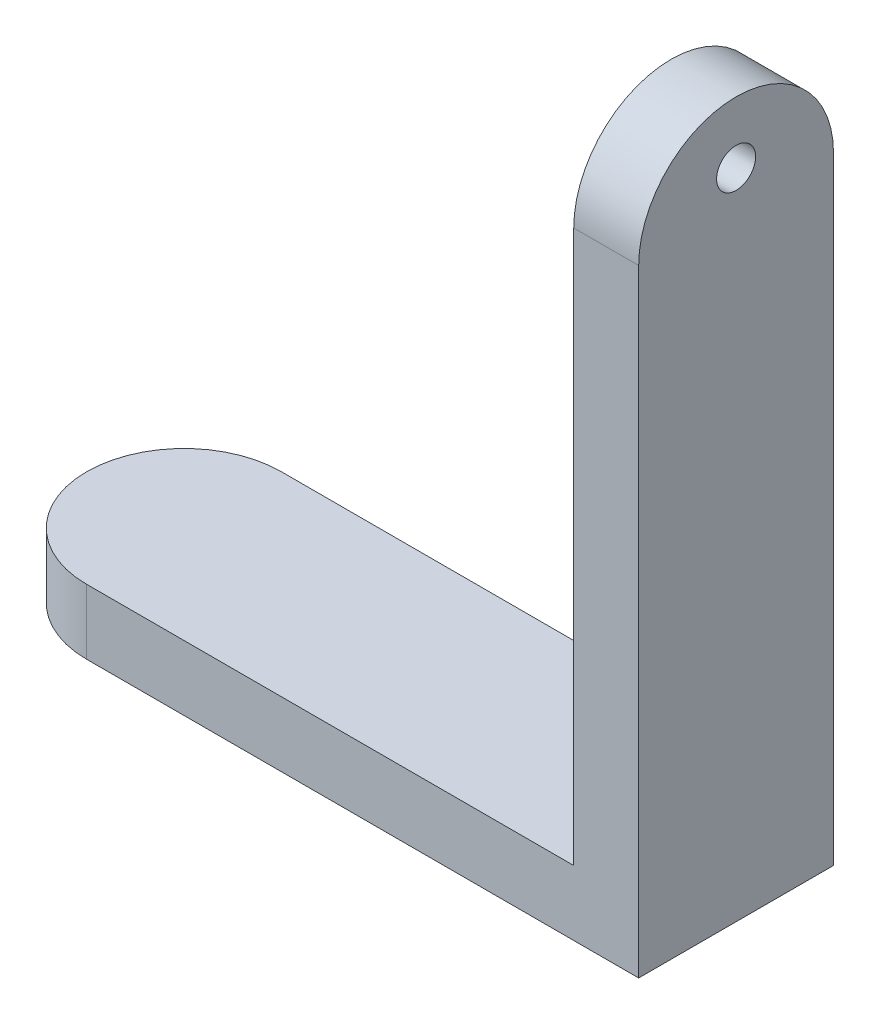
ISO-10303-21;
HEADER;
FILE_DESCRIPTION(('STEP AP214'),'2;1');
FILE_NAME('part.step','',(''),(''),'','','');
FILE_SCHEMA(('AUTOMOTIVE_DESIGN { 1 0 10303 214 1 1 1 1 }'));
ENDSEC;
DATA;
#1=APPLICATION_CONTEXT('core data for automotive mechanical design processes');
#2=APPLICATION_PROTOCOL_DEFINITION('international standard','automotive_design',2000,#1);
#3=PRODUCT_CONTEXT('',#1,'mechanical');
#4=PRODUCT('Part','Part','',(#3));
#5=PRODUCT_RELATED_PRODUCT_CATEGORY('part','',(#4));
#6=PRODUCT_DEFINITION_FORMATION('','',#4);
#7=PRODUCT_DEFINITION_CONTEXT('part definition',#1,'design');
#8=PRODUCT_DEFINITION('design','',#6,#7);
#9=PRODUCT_DEFINITION_SHAPE('','',#8);
#10=(LENGTH_UNIT() NAMED_UNIT(*) SI_UNIT(.MILLI.,.METRE.));
#11=(NAMED_UNIT(*) PLANE_ANGLE_UNIT() SI_UNIT($,.RADIAN.));
#12=(NAMED_UNIT(*) SI_UNIT($,.STERADIAN.) SOLID_ANGLE_UNIT());
#13=UNCERTAINTY_MEASURE_WITH_UNIT(LENGTH_MEASURE(1.E-05),#10,'distance_accuracy_value','');
#14=(GEOMETRIC_REPRESENTATION_CONTEXT(3) GLOBAL_UNCERTAINTY_ASSIGNED_CONTEXT((#13)) GLOBAL_UNIT_ASSIGNED_CONTEXT((#10,
#11,#12)) REPRESENTATION_CONTEXT('',''));
#15=CARTESIAN_POINT('',(0.,0.,0.));
#16=DIRECTION('',(0.,0.,1.));
#17=DIRECTION('',(1.,0.,0.));
#18=AXIS2_PLACEMENT_3D('',#15,#16,#17);
#19=CARTESIAN_POINT('',(10.16,24.13,0.));
#20=DIRECTION('',(-1.,0.,0.));
#21=DIRECTION('',(0.,0.,1.));
#22=AXIS2_PLACEMENT_3D('',#19,#20,#21);
#23=CYLINDRICAL_SURFACE('',#22,3.81);
#24=DIRECTION('',(1.,0.,0.));
#25=VECTOR('',#24,1.);
#26=CARTESIAN_POINT('',(10.16,24.13,-3.81));
#27=LINE('',#26,#25);
#28=CARTESIAN_POINT('',(10.16,24.13,-3.81));
#29=VERTEX_POINT('',#28);
#30=CARTESIAN_POINT('',(12.7,24.13,-3.81));
#31=VERTEX_POINT('',#30);
#32=EDGE_CURVE('E140',#29,#31,#27,.T.);
#33=ORIENTED_EDGE('',*,*,#32,.F.);
#34=CARTESIAN_POINT('',(10.16,24.13,0.));
#35=DIRECTION('',(1.,0.,0.));
#36=DIRECTION('',(0.,0.,-1.));
#37=AXIS2_PLACEMENT_3D('',#34,#35,#36);
#38=CIRCLE('',#37,3.81);
#39=CARTESIAN_POINT('',(10.16,24.13,3.81));
#40=VERTEX_POINT('',#39);
#41=EDGE_CURVE('E45',#40,#29,#38,.F.);
#42=ORIENTED_EDGE('',*,*,#41,.F.);
#43=DIRECTION('',(1.,0.,0.));
#44=VECTOR('',#43,1.);
#45=CARTESIAN_POINT('',(10.16,24.13,3.81));
#46=LINE('',#45,#44);
#47=CARTESIAN_POINT('',(12.7,24.13,3.81));
#48=VERTEX_POINT('',#47);
#49=EDGE_CURVE('E93',#48,#40,#46,.F.);
#50=ORIENTED_EDGE('',*,*,#49,.F.);
#51=CARTESIAN_POINT('',(12.7,24.13,0.));
#52=DIRECTION('',(-1.,0.,0.));
#53=DIRECTION('',(0.,0.,1.));
#54=AXIS2_PLACEMENT_3D('',#51,#52,#53);
#55=CIRCLE('',#54,3.81);
#56=EDGE_CURVE('E11',#31,#48,#55,.F.);
#57=ORIENTED_EDGE('',*,*,#56,.F.);
#58=EDGE_LOOP('',(#33,#42,#50,#57));
#59=FACE_BOUND('',#58,.T.);
#60=ADVANCED_FACE('F37',(#59),#23,.T.);
#61=CARTESIAN_POINT('',(-8.89,2.54,0.));
#62=DIRECTION('',(0.,-1.,0.));
#63=DIRECTION('',(0.,0.,-1.));
#64=AXIS2_PLACEMENT_3D('',#61,#62,#63);
#65=CYLINDRICAL_SURFACE('',#64,3.81);
#66=DIRECTION('',(0.,-1.,0.));
#67=VECTOR('',#66,1.);
#68=CARTESIAN_POINT('',(-8.89,2.54,3.81));
#69=LINE('',#68,#67);
#70=CARTESIAN_POINT('',(-8.89,2.54,3.81));
#71=VERTEX_POINT('',#70);
#72=CARTESIAN_POINT('',(-8.89,0.,3.81));
#73=VERTEX_POINT('',#72);
#74=EDGE_CURVE('E132',#71,#73,#69,.T.);
#75=ORIENTED_EDGE('',*,*,#74,.F.);
#76=CARTESIAN_POINT('',(-8.89,2.54,0.));
#77=DIRECTION('',(0.,1.,0.));
#78=DIRECTION('',(0.,0.,1.));
#79=AXIS2_PLACEMENT_3D('',#76,#77,#78);
#80=CIRCLE('',#79,3.81);
#81=CARTESIAN_POINT('',(-8.89,2.54,-3.81));
#82=VERTEX_POINT('',#81);
#83=EDGE_CURVE('E104',#82,#71,#80,.T.);
#84=ORIENTED_EDGE('',*,*,#83,.F.);
#85=DIRECTION('',(0.,-1.,0.));
#86=VECTOR('',#85,1.);
#87=CARTESIAN_POINT('',(-8.89,2.54,-3.81));
#88=LINE('',#87,#86);
#89=CARTESIAN_POINT('',(-8.89,0.,-3.81));
#90=VERTEX_POINT('',#89);
#91=EDGE_CURVE('E134',#90,#82,#88,.F.);
#92=ORIENTED_EDGE('',*,*,#91,.F.);
#93=CARTESIAN_POINT('',(-8.89,0.,0.));
#94=DIRECTION('',(0.,1.,0.));
#95=DIRECTION('',(0.,0.,1.));
#96=AXIS2_PLACEMENT_3D('',#93,#94,#95);
#97=CIRCLE('',#96,3.81);
#98=EDGE_CURVE('E138',#73,#90,#97,.F.);
#99=ORIENTED_EDGE('',*,*,#98,.F.);
#100=EDGE_LOOP('',(#75,#84,#92,#99));
#101=FACE_BOUND('',#100,.T.);
#102=ADVANCED_FACE('F148',(#101),#65,.T.);
#103=CARTESIAN_POINT('',(12.7,2.54,3.81));
#104=DIRECTION('',(0.,0.,-1.));
#105=DIRECTION('',(-1.,0.,0.));
#106=AXIS2_PLACEMENT_3D('',#103,#104,#105);
#107=PLANE('',#106);
#108=DIRECTION('',(0.,-1.,0.));
#109=VECTOR('',#108,1.);
#110=CARTESIAN_POINT('',(12.7,2.54,3.81));
#111=LINE('',#110,#109);
#112=CARTESIAN_POINT('',(12.7,0.,3.81));
#113=VERTEX_POINT('',#112);
#114=EDGE_CURVE('E130',#48,#113,#111,.T.);
#115=ORIENTED_EDGE('',*,*,#114,.F.);
#116=ORIENTED_EDGE('',*,*,#49,.T.);
#117=DIRECTION('',(0.,-1.,0.));
#118=VECTOR('',#117,1.);
#119=CARTESIAN_POINT('',(10.16,27.94,3.81));
#120=LINE('',#119,#118);
#121=CARTESIAN_POINT('',(10.16,2.54,3.81));
#122=VERTEX_POINT('',#121);
#123=EDGE_CURVE('E87',#40,#122,#120,.T.);
#124=ORIENTED_EDGE('',*,*,#123,.T.);
#125=DIRECTION('',(1.,0.,0.));
#126=VECTOR('',#125,1.);
#127=CARTESIAN_POINT('',(12.7,2.54,3.81));
#128=LINE('',#127,#126);
#129=EDGE_CURVE('E92',#71,#122,#128,.T.);
#130=ORIENTED_EDGE('',*,*,#129,.F.);
#131=ORIENTED_EDGE('',*,*,#74,.T.);
#132=DIRECTION('',(1.,0.,0.));
#133=VECTOR('',#132,1.);
#134=CARTESIAN_POINT('',(12.7,0.,3.81));
#135=LINE('',#134,#133);
#136=EDGE_CURVE('E118',#73,#113,#135,.T.);
#137=ORIENTED_EDGE('',*,*,#136,.T.);
#138=EDGE_LOOP('',(#115,#116,#124,#130,#131,#137));
#139=FACE_BOUND('',#138,.T.);
#140=ADVANCED_FACE('F90',(#139),#107,.F.);
#141=CARTESIAN_POINT('',(12.7,2.54,3.81));
#142=DIRECTION('',(-1.,0.,0.));
#143=DIRECTION('',(0.,0.,1.));
#144=AXIS2_PLACEMENT_3D('',#141,#142,#143);
#145=PLANE('',#144);
#146=CARTESIAN_POINT('',(12.7,25.5316893067659,0.));
#147=DIRECTION('',(-1.,0.,0.));
#148=DIRECTION('',(0.,0.,1.));
#149=AXIS2_PLACEMENT_3D('',#146,#147,#148);
#150=CIRCLE('',#149,0.762);
#151=CARTESIAN_POINT('',(12.7,25.5316893067659,0.762));
#152=VERTEX_POINT('',#151);
#153=EDGE_CURVE('E111',#152,#152,#150,.T.);
#154=ORIENTED_EDGE('',*,*,#153,.T.);
#155=EDGE_LOOP('',(#154));
#156=FACE_BOUND('',#155,.T.);
#157=DIRECTION('',(0.,-1.,0.));
#158=VECTOR('',#157,1.);
#159=CARTESIAN_POINT('',(12.7,2.54,-3.81));
#160=LINE('',#159,#158);
#161=CARTESIAN_POINT('',(12.7,0.,-3.81));
#162=VERTEX_POINT('',#161);
#163=EDGE_CURVE('E121',#31,#162,#160,.T.);
#164=ORIENTED_EDGE('',*,*,#163,.F.);
#165=ORIENTED_EDGE('',*,*,#56,.T.);
#166=ORIENTED_EDGE('',*,*,#114,.T.);
#167=DIRECTION('',(0.,0.,-1.));
#168=VECTOR('',#167,1.);
#169=CARTESIAN_POINT('',(12.7,0.,3.81));
#170=LINE('',#169,#168);
#171=EDGE_CURVE('E124',#113,#162,#170,.T.);
#172=ORIENTED_EDGE('',*,*,#171,.T.);
#173=EDGE_LOOP('',(#164,#165,#166,#172));
#174=FACE_BOUND('',#173,.T.);
#175=ADVANCED_FACE('F153',(#156,#174),#145,.F.);
#176=CARTESIAN_POINT('',(12.7,2.54,-3.81));
#177=DIRECTION('',(0.,0.,1.));
#178=DIRECTION('',(1.,0.,0.));
#179=AXIS2_PLACEMENT_3D('',#176,#177,#178);
#180=PLANE('',#179);
#181=DIRECTION('',(0.,-1.,0.));
#182=VECTOR('',#181,1.);
#183=CARTESIAN_POINT('',(10.16,27.94,-3.81));
#184=LINE('',#183,#182);
#185=CARTESIAN_POINT('',(10.16,2.54,-3.81));
#186=VERTEX_POINT('',#185);
#187=EDGE_CURVE('E96',#29,#186,#184,.T.);
#188=ORIENTED_EDGE('',*,*,#187,.F.);
#189=ORIENTED_EDGE('',*,*,#32,.T.);
#190=ORIENTED_EDGE('',*,*,#163,.T.);
#191=DIRECTION('',(-1.,0.,0.));
#192=VECTOR('',#191,1.);
#193=CARTESIAN_POINT('',(12.7,0.,-3.81));
#194=LINE('',#193,#192);
#195=EDGE_CURVE('E107',#162,#90,#194,.T.);
#196=ORIENTED_EDGE('',*,*,#195,.T.);
#197=ORIENTED_EDGE('',*,*,#91,.T.);
#198=DIRECTION('',(-1.,0.,0.));
#199=VECTOR('',#198,1.);
#200=CARTESIAN_POINT('',(12.7,2.54,-3.81));
#201=LINE('',#200,#199);
#202=EDGE_CURVE('E106',#186,#82,#201,.T.);
#203=ORIENTED_EDGE('',*,*,#202,.F.);
#204=EDGE_LOOP('',(#188,#189,#190,#196,#197,#203));
#205=FACE_BOUND('',#204,.T.);
#206=ADVANCED_FACE('F144',(#205),#180,.F.);
#207=CARTESIAN_POINT('',(0.,2.54,0.));
#208=DIRECTION('',(0.,1.,0.));
#209=DIRECTION('',(0.,0.,1.));
#210=AXIS2_PLACEMENT_3D('',#207,#208,#209);
#211=PLANE('',#210);
#212=ORIENTED_EDGE('',*,*,#202,.T.);
#213=ORIENTED_EDGE('',*,*,#83,.T.);
#214=ORIENTED_EDGE('',*,*,#129,.T.);
#215=DIRECTION('',(0.,0.,1.));
#216=VECTOR('',#215,1.);
#217=CARTESIAN_POINT('',(10.16,2.54,3.81));
#218=LINE('',#217,#216);
#219=EDGE_CURVE('E97',#186,#122,#218,.T.);
#220=ORIENTED_EDGE('',*,*,#219,.F.);
#221=EDGE_LOOP('',(#212,#213,#214,#220));
#222=FACE_BOUND('',#221,.T.);
#223=ADVANCED_FACE('F102',(#222),#211,.T.);
#224=CARTESIAN_POINT('',(0.,0.,0.));
#225=DIRECTION('',(0.,1.,0.));
#226=DIRECTION('',(0.,0.,1.));
#227=AXIS2_PLACEMENT_3D('',#224,#225,#226);
#228=PLANE('',#227);
#229=ORIENTED_EDGE('',*,*,#136,.F.);
#230=ORIENTED_EDGE('',*,*,#98,.T.);
#231=ORIENTED_EDGE('',*,*,#195,.F.);
#232=ORIENTED_EDGE('',*,*,#171,.F.);
#233=EDGE_LOOP('',(#229,#230,#231,#232));
#234=FACE_BOUND('',#233,.T.);
#235=ADVANCED_FACE('F152',(#234),#228,.F.);
#236=CARTESIAN_POINT('',(10.16,27.94,3.81));
#237=DIRECTION('',(1.,0.,0.));
#238=DIRECTION('',(0.,0.,-1.));
#239=AXIS2_PLACEMENT_3D('',#236,#237,#238);
#240=PLANE('',#239);
#241=CARTESIAN_POINT('',(10.16,25.5316893067659,0.));
#242=DIRECTION('',(-1.,0.,0.));
#243=DIRECTION('',(0.,0.,1.));
#244=AXIS2_PLACEMENT_3D('',#241,#242,#243);
#245=CIRCLE('',#244,0.762);
#246=CARTESIAN_POINT('',(10.16,25.5316893067659,0.762));
#247=VERTEX_POINT('',#246);
#248=EDGE_CURVE('E114',#247,#247,#245,.T.);
#249=ORIENTED_EDGE('',*,*,#248,.F.);
#250=EDGE_LOOP('',(#249));
#251=FACE_BOUND('',#250,.T.);
#252=ORIENTED_EDGE('',*,*,#123,.F.);
#253=ORIENTED_EDGE('',*,*,#41,.T.);
#254=ORIENTED_EDGE('',*,*,#187,.T.);
#255=ORIENTED_EDGE('',*,*,#219,.T.);
#256=EDGE_LOOP('',(#252,#253,#254,#255));
#257=FACE_BOUND('',#256,.T.);
#258=ADVANCED_FACE('F109',(#251,#257),#240,.F.);
#259=CARTESIAN_POINT('',(35.56,25.5316893067659,0.));
#260=DIRECTION('',(-1.,0.,0.));
#261=DIRECTION('',(0.,0.,1.));
#262=AXIS2_PLACEMENT_3D('',#259,#260,#261);
#263=CYLINDRICAL_SURFACE('',#262,0.762);
#264=ORIENTED_EDGE('',*,*,#248,.T.);
#265=EDGE_LOOP('',(#264));
#266=FACE_BOUND('',#265,.T.);
#267=ORIENTED_EDGE('',*,*,#153,.F.);
#268=EDGE_LOOP('',(#267));
#269=FACE_BOUND('',#268,.T.);
#270=ADVANCED_FACE('F205',(#266,#269),#263,.F.);
#271=CLOSED_SHELL('',(#60,#102,#140,#175,#206,#223,#235,#258,#270));
#272=MANIFOLD_SOLID_BREP('B2',#271);
#273=ADVANCED_BREP_SHAPE_REPRESENTATION('',(#18,#272),#14);
#274=SHAPE_DEFINITION_REPRESENTATION(#9,#273);
ENDSEC;
END-ISO-10303-21;
